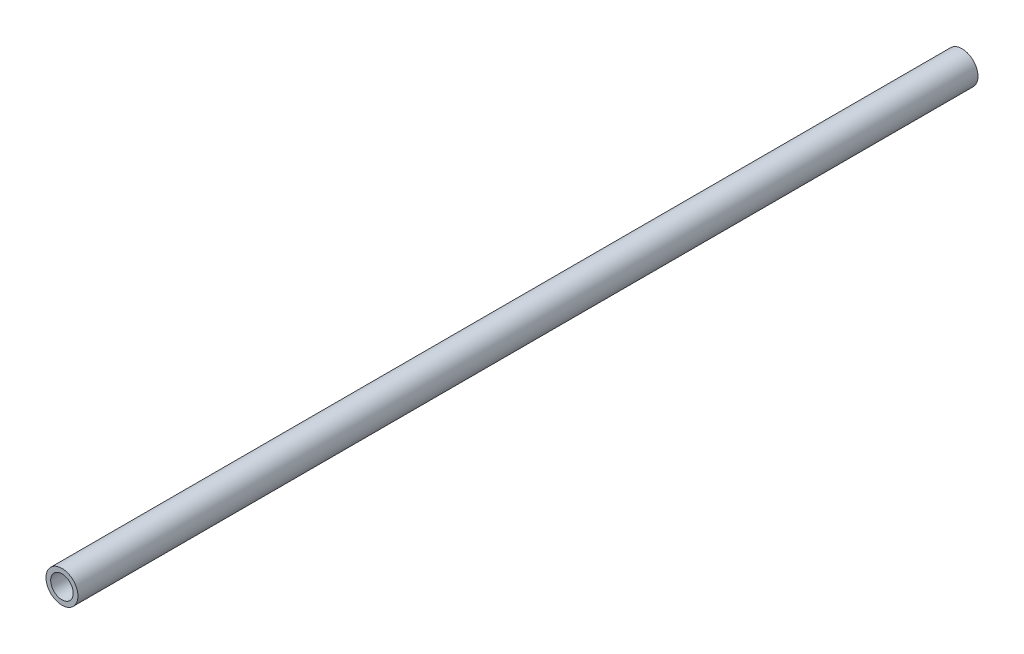
ISO-10303-21;
HEADER;
FILE_DESCRIPTION(('STEP AP214'),'2;1');
FILE_NAME('part.step','',(''),(''),'','','');
FILE_SCHEMA(('AUTOMOTIVE_DESIGN { 1 0 10303 214 1 1 1 1 }'));
ENDSEC;
DATA;
#1=APPLICATION_CONTEXT('core data for automotive mechanical design processes');
#2=APPLICATION_PROTOCOL_DEFINITION('international standard','automotive_design',2000,#1);
#3=PRODUCT_CONTEXT('',#1,'mechanical');
#4=PRODUCT('Part','Part','',(#3));
#5=PRODUCT_RELATED_PRODUCT_CATEGORY('part','',(#4));
#6=PRODUCT_DEFINITION_FORMATION('','',#4);
#7=PRODUCT_DEFINITION_CONTEXT('part definition',#1,'design');
#8=PRODUCT_DEFINITION('design','',#6,#7);
#9=PRODUCT_DEFINITION_SHAPE('','',#8);
#10=(LENGTH_UNIT() NAMED_UNIT(*) SI_UNIT(.MILLI.,.METRE.));
#11=(NAMED_UNIT(*) PLANE_ANGLE_UNIT() SI_UNIT($,.RADIAN.));
#12=(NAMED_UNIT(*) SI_UNIT($,.STERADIAN.) SOLID_ANGLE_UNIT());
#13=UNCERTAINTY_MEASURE_WITH_UNIT(LENGTH_MEASURE(1.E-05),#10,'distance_accuracy_value','');
#14=(GEOMETRIC_REPRESENTATION_CONTEXT(3) GLOBAL_UNCERTAINTY_ASSIGNED_CONTEXT((#13)) GLOBAL_UNIT_ASSIGNED_CONTEXT((#10,
#11,#12)) REPRESENTATION_CONTEXT('',''));
#15=CARTESIAN_POINT('',(0.,0.,0.));
#16=DIRECTION('',(0.,0.,1.));
#17=DIRECTION('',(1.,0.,0.));
#18=AXIS2_PLACEMENT_3D('',#15,#16,#17);
#19=CARTESIAN_POINT('',(0.,0.,600.));
#20=DIRECTION('',(0.,0.,1.));
#21=DIRECTION('',(1.,0.,0.));
#22=AXIS2_PLACEMENT_3D('',#19,#20,#21);
#23=PLANE('',#22);
#24=CARTESIAN_POINT('',(0.,0.,600.));
#25=DIRECTION('',(0.,0.,1.));
#26=DIRECTION('',(1.,0.,0.));
#27=AXIS2_PLACEMENT_3D('',#24,#25,#26);
#28=CIRCLE('',#27,10.65);
#29=CARTESIAN_POINT('',(10.65,0.,600.));
#30=VERTEX_POINT('',#29);
#31=EDGE_CURVE('E10',#30,#30,#28,.T.);
#32=ORIENTED_EDGE('',*,*,#31,.T.);
#33=EDGE_LOOP('',(#32));
#34=FACE_BOUND('',#33,.T.);
#35=CARTESIAN_POINT('',(0.,0.,600.));
#36=DIRECTION('',(0.,0.,1.));
#37=DIRECTION('',(1.,0.,0.));
#38=AXIS2_PLACEMENT_3D('',#35,#36,#37);
#39=CIRCLE('',#38,7.5);
#40=CARTESIAN_POINT('',(7.5,0.,600.));
#41=VERTEX_POINT('',#40);
#42=EDGE_CURVE('E48',#41,#41,#39,.T.);
#43=ORIENTED_EDGE('',*,*,#42,.F.);
#44=EDGE_LOOP('',(#43));
#45=FACE_BOUND('',#44,.T.);
#46=ADVANCED_FACE('F37',(#34,#45),#23,.T.);
#47=CARTESIAN_POINT('',(0.,0.,0.));
#48=DIRECTION('',(0.,0.,1.));
#49=DIRECTION('',(1.,0.,0.));
#50=AXIS2_PLACEMENT_3D('',#47,#48,#49);
#51=PLANE('',#50);
#52=CARTESIAN_POINT('',(0.,0.,0.));
#53=DIRECTION('',(0.,0.,1.));
#54=DIRECTION('',(1.,0.,0.));
#55=AXIS2_PLACEMENT_3D('',#52,#53,#54);
#56=CIRCLE('',#55,10.65);
#57=CARTESIAN_POINT('',(10.65,0.,0.));
#58=VERTEX_POINT('',#57);
#59=EDGE_CURVE('E41',#58,#58,#56,.T.);
#60=ORIENTED_EDGE('',*,*,#59,.F.);
#61=EDGE_LOOP('',(#60));
#62=FACE_BOUND('',#61,.T.);
#63=CARTESIAN_POINT('',(0.,0.,0.));
#64=DIRECTION('',(0.,0.,1.));
#65=DIRECTION('',(1.,0.,0.));
#66=AXIS2_PLACEMENT_3D('',#63,#64,#65);
#67=CIRCLE('',#66,7.5);
#68=CARTESIAN_POINT('',(7.5,0.,0.));
#69=VERTEX_POINT('',#68);
#70=EDGE_CURVE('E50',#69,#69,#67,.T.);
#71=ORIENTED_EDGE('',*,*,#70,.T.);
#72=EDGE_LOOP('',(#71));
#73=FACE_BOUND('',#72,.T.);
#74=ADVANCED_FACE('F60',(#62,#73),#51,.F.);
#75=CARTESIAN_POINT('',(0.,0.,600.));
#76=DIRECTION('',(0.,0.,-1.));
#77=DIRECTION('',(-1.,0.,0.));
#78=AXIS2_PLACEMENT_3D('',#75,#76,#77);
#79=CYLINDRICAL_SURFACE('',#78,10.65);
#80=ORIENTED_EDGE('',*,*,#31,.F.);
#81=EDGE_LOOP('',(#80));
#82=FACE_BOUND('',#81,.T.);
#83=ORIENTED_EDGE('',*,*,#59,.T.);
#84=EDGE_LOOP('',(#83));
#85=FACE_BOUND('',#84,.T.);
#86=ADVANCED_FACE('F39',(#82,#85),#79,.T.);
#87=CARTESIAN_POINT('',(0.,0.,600.));
#88=DIRECTION('',(0.,0.,-1.));
#89=DIRECTION('',(-1.,0.,0.));
#90=AXIS2_PLACEMENT_3D('',#87,#88,#89);
#91=CYLINDRICAL_SURFACE('',#90,7.5);
#92=ORIENTED_EDGE('',*,*,#42,.T.);
#93=EDGE_LOOP('',(#92));
#94=FACE_BOUND('',#93,.T.);
#95=ORIENTED_EDGE('',*,*,#70,.F.);
#96=EDGE_LOOP('',(#95));
#97=FACE_BOUND('',#96,.T.);
#98=ADVANCED_FACE('F56',(#94,#97),#91,.F.);
#99=CLOSED_SHELL('',(#46,#74,#86,#98));
#100=MANIFOLD_SOLID_BREP('B2',#99);
#101=ADVANCED_BREP_SHAPE_REPRESENTATION('',(#18,#100),#14);
#102=SHAPE_DEFINITION_REPRESENTATION(#9,#101);
ENDSEC;
END-ISO-10303-21;
